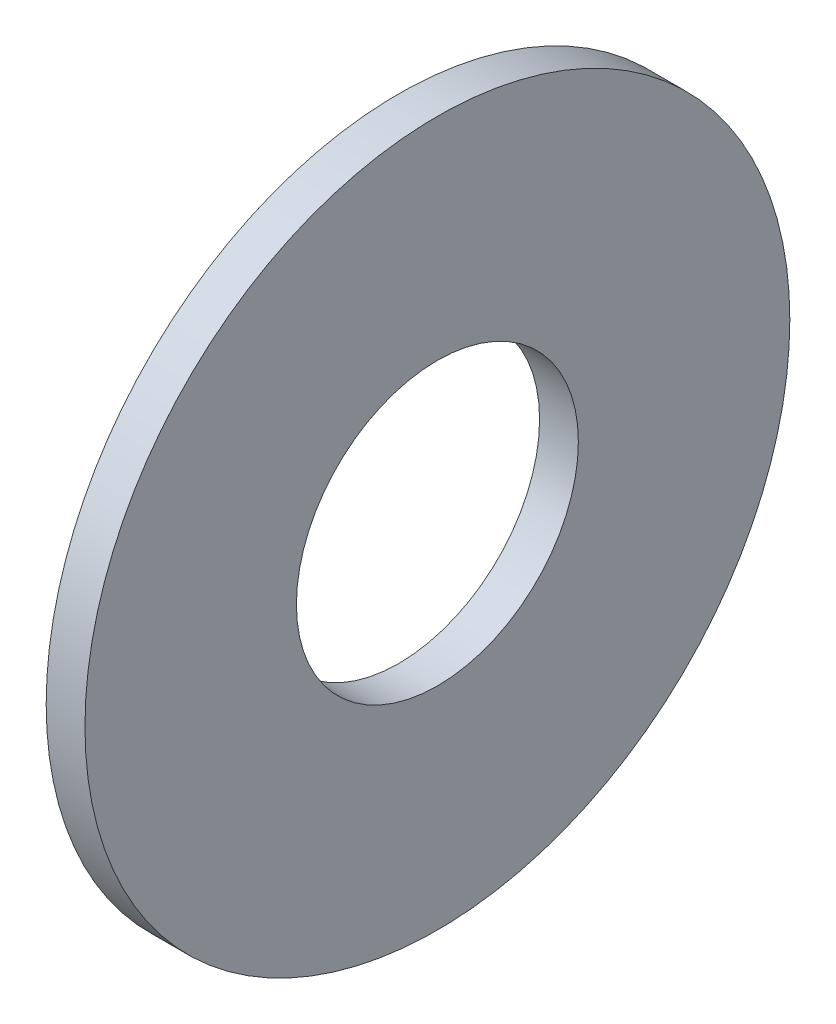
ISO-10303-21;
HEADER;
FILE_DESCRIPTION(('STEP AP214'),'2;1');
FILE_NAME('part.step','',(''),(''),'','','');
FILE_SCHEMA(('AUTOMOTIVE_DESIGN { 1 0 10303 214 1 1 1 1 }'));
ENDSEC;
DATA;
#1=APPLICATION_CONTEXT('core data for automotive mechanical design processes');
#2=APPLICATION_PROTOCOL_DEFINITION('international standard','automotive_design',2000,#1);
#3=PRODUCT_CONTEXT('',#1,'mechanical');
#4=PRODUCT('Part','Part','',(#3));
#5=PRODUCT_RELATED_PRODUCT_CATEGORY('part','',(#4));
#6=PRODUCT_DEFINITION_FORMATION('','',#4);
#7=PRODUCT_DEFINITION_CONTEXT('part definition',#1,'design');
#8=PRODUCT_DEFINITION('design','',#6,#7);
#9=PRODUCT_DEFINITION_SHAPE('','',#8);
#10=(LENGTH_UNIT() NAMED_UNIT(*) SI_UNIT(.MILLI.,.METRE.));
#11=(NAMED_UNIT(*) PLANE_ANGLE_UNIT() SI_UNIT($,.RADIAN.));
#12=(NAMED_UNIT(*) SI_UNIT($,.STERADIAN.) SOLID_ANGLE_UNIT());
#13=UNCERTAINTY_MEASURE_WITH_UNIT(LENGTH_MEASURE(1.E-05),#10,'distance_accuracy_value','');
#14=(GEOMETRIC_REPRESENTATION_CONTEXT(3) GLOBAL_UNCERTAINTY_ASSIGNED_CONTEXT((#13)) GLOBAL_UNIT_ASSIGNED_CONTEXT((#10,
#11,#12)) REPRESENTATION_CONTEXT('',''));
#15=CARTESIAN_POINT('',(0.,0.,0.));
#16=DIRECTION('',(0.,0.,1.));
#17=DIRECTION('',(1.,0.,0.));
#18=AXIS2_PLACEMENT_3D('',#15,#16,#17);
#19=CARTESIAN_POINT('',(0.55,0.,0.));
#20=DIRECTION('',(1.,0.,0.));
#21=DIRECTION('',(0.,0.,-1.));
#22=AXIS2_PLACEMENT_3D('',#19,#20,#21);
#23=PLANE('',#22);
#24=CARTESIAN_POINT('',(0.55,0.,0.));
#25=DIRECTION('',(1.,0.,0.));
#26=DIRECTION('',(0.,0.,-1.));
#27=AXIS2_PLACEMENT_3D('',#24,#25,#26);
#28=CIRCLE('',#27,5.);
#29=CARTESIAN_POINT('',(0.55,0.,-5.));
#30=VERTEX_POINT('',#29);
#31=EDGE_CURVE('E10',#30,#30,#28,.T.);
#32=ORIENTED_EDGE('',*,*,#31,.T.);
#33=EDGE_LOOP('',(#32));
#34=FACE_BOUND('',#33,.T.);
#35=CARTESIAN_POINT('',(0.55,0.,0.));
#36=DIRECTION('',(1.,0.,0.));
#37=DIRECTION('',(0.,0.,-1.));
#38=AXIS2_PLACEMENT_3D('',#35,#36,#37);
#39=CIRCLE('',#38,2.);
#40=CARTESIAN_POINT('',(0.55,0.,-2.));
#41=VERTEX_POINT('',#40);
#42=EDGE_CURVE('E48',#41,#41,#39,.T.);
#43=ORIENTED_EDGE('',*,*,#42,.F.);
#44=EDGE_LOOP('',(#43));
#45=FACE_BOUND('',#44,.T.);
#46=ADVANCED_FACE('F40',(#34,#45),#23,.T.);
#47=CARTESIAN_POINT('',(0.,0.,0.));
#48=DIRECTION('',(1.,0.,0.));
#49=DIRECTION('',(0.,0.,-1.));
#50=AXIS2_PLACEMENT_3D('',#47,#48,#49);
#51=PLANE('',#50);
#52=CARTESIAN_POINT('',(0.,0.,0.));
#53=DIRECTION('',(1.,0.,0.));
#54=DIRECTION('',(0.,0.,-1.));
#55=AXIS2_PLACEMENT_3D('',#52,#53,#54);
#56=CIRCLE('',#55,5.);
#57=CARTESIAN_POINT('',(0.,0.,-5.));
#58=VERTEX_POINT('',#57);
#59=EDGE_CURVE('E41',#58,#58,#56,.T.);
#60=ORIENTED_EDGE('',*,*,#59,.F.);
#61=EDGE_LOOP('',(#60));
#62=FACE_BOUND('',#61,.T.);
#63=CARTESIAN_POINT('',(0.,0.,0.));
#64=DIRECTION('',(1.,0.,0.));
#65=DIRECTION('',(0.,0.,-1.));
#66=AXIS2_PLACEMENT_3D('',#63,#64,#65);
#67=CIRCLE('',#66,2.);
#68=CARTESIAN_POINT('',(0.,0.,-2.));
#69=VERTEX_POINT('',#68);
#70=EDGE_CURVE('E49',#69,#69,#67,.T.);
#71=ORIENTED_EDGE('',*,*,#70,.T.);
#72=EDGE_LOOP('',(#71));
#73=FACE_BOUND('',#72,.T.);
#74=ADVANCED_FACE('F58',(#62,#73),#51,.F.);
#75=CARTESIAN_POINT('',(0.55,0.,0.));
#76=DIRECTION('',(-1.,0.,0.));
#77=DIRECTION('',(0.,0.,1.));
#78=AXIS2_PLACEMENT_3D('',#75,#76,#77);
#79=CYLINDRICAL_SURFACE('',#78,5.);
#80=ORIENTED_EDGE('',*,*,#31,.F.);
#81=EDGE_LOOP('',(#80));
#82=FACE_BOUND('',#81,.T.);
#83=ORIENTED_EDGE('',*,*,#59,.T.);
#84=EDGE_LOOP('',(#83));
#85=FACE_BOUND('',#84,.T.);
#86=ADVANCED_FACE('F39',(#82,#85),#79,.T.);
#87=CARTESIAN_POINT('',(0.55,0.,0.));
#88=DIRECTION('',(-1.,0.,0.));
#89=DIRECTION('',(0.,0.,1.));
#90=AXIS2_PLACEMENT_3D('',#87,#88,#89);
#91=CYLINDRICAL_SURFACE('',#90,2.);
#92=ORIENTED_EDGE('',*,*,#42,.T.);
#93=EDGE_LOOP('',(#92));
#94=FACE_BOUND('',#93,.T.);
#95=ORIENTED_EDGE('',*,*,#70,.F.);
#96=EDGE_LOOP('',(#95));
#97=FACE_BOUND('',#96,.T.);
#98=ADVANCED_FACE('F57',(#94,#97),#91,.F.);
#99=CLOSED_SHELL('',(#46,#74,#86,#98));
#100=MANIFOLD_SOLID_BREP('B2',#99);
#101=ADVANCED_BREP_SHAPE_REPRESENTATION('',(#18,#100),#14);
#102=SHAPE_DEFINITION_REPRESENTATION(#9,#101);
ENDSEC;
END-ISO-10303-21;
